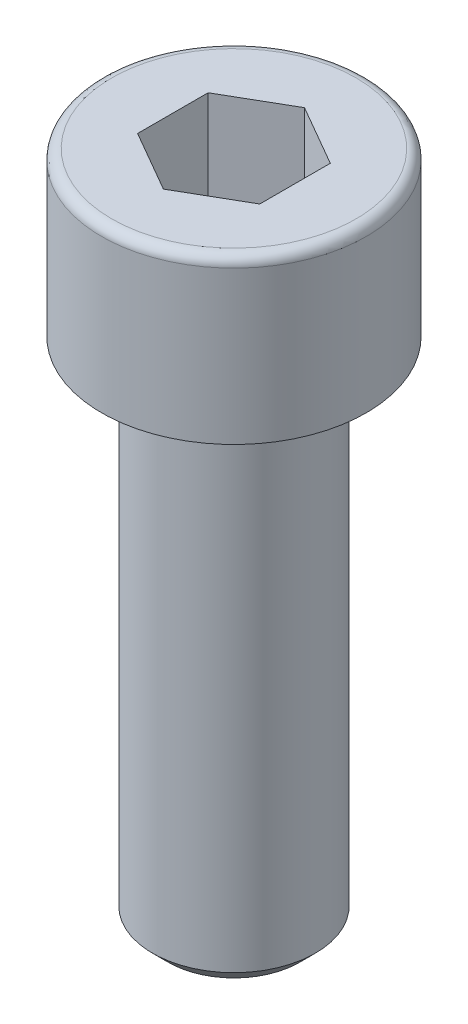
ISO-10303-21;
HEADER;
FILE_DESCRIPTION(('STEP AP214'),'2;1');
FILE_NAME('part.step','',(''),(''),'','','');
FILE_SCHEMA(('AUTOMOTIVE_DESIGN { 1 0 10303 214 1 1 1 1 }'));
ENDSEC;
DATA;
#1=APPLICATION_CONTEXT('core data for automotive mechanical design processes');
#2=APPLICATION_PROTOCOL_DEFINITION('international standard','automotive_design',2000,#1);
#3=PRODUCT_CONTEXT('',#1,'mechanical');
#4=PRODUCT('Part','Part','',(#3));
#5=PRODUCT_RELATED_PRODUCT_CATEGORY('part','',(#4));
#6=PRODUCT_DEFINITION_FORMATION('','',#4);
#7=PRODUCT_DEFINITION_CONTEXT('part definition',#1,'design');
#8=PRODUCT_DEFINITION('design','',#6,#7);
#9=PRODUCT_DEFINITION_SHAPE('','',#8);
#10=(LENGTH_UNIT() NAMED_UNIT(*) SI_UNIT(.MILLI.,.METRE.));
#11=(NAMED_UNIT(*) PLANE_ANGLE_UNIT() SI_UNIT($,.RADIAN.));
#12=(NAMED_UNIT(*) SI_UNIT($,.STERADIAN.) SOLID_ANGLE_UNIT());
#13=UNCERTAINTY_MEASURE_WITH_UNIT(LENGTH_MEASURE(1.E-05),#10,'distance_accuracy_value','');
#14=(GEOMETRIC_REPRESENTATION_CONTEXT(3) GLOBAL_UNCERTAINTY_ASSIGNED_CONTEXT((#13)) GLOBAL_UNIT_ASSIGNED_CONTEXT((#10,
#11,#12)) REPRESENTATION_CONTEXT('',''));
#15=CARTESIAN_POINT('',(0.,0.,0.));
#16=DIRECTION('',(0.,0.,1.));
#17=DIRECTION('',(1.,0.,0.));
#18=AXIS2_PLACEMENT_3D('',#15,#16,#17);
#19=CARTESIAN_POINT('',(0.,8.,0.));
#20=DIRECTION('',(0.,-1.,0.));
#21=DIRECTION('',(0.,0.,-1.));
#22=AXIS2_PLACEMENT_3D('',#19,#20,#21);
#23=PLANE('',#22);
#24=DIRECTION('',(0.866025403784438,0.,0.500000000000001));
#25=VECTOR('',#24,1.);
#26=CARTESIAN_POINT('',(-3.,8.,1.7320508075689));
#27=LINE('',#26,#25);
#28=CARTESIAN_POINT('',(-3.,8.,1.7320508075689));
#29=VERTEX_POINT('',#28);
#30=CARTESIAN_POINT('',(0.,8.,3.4641016151378));
#31=VERTEX_POINT('',#30);
#32=EDGE_CURVE('E71',#29,#31,#27,.T.);
#33=ORIENTED_EDGE('',*,*,#32,.F.);
#34=DIRECTION('',(0.,0.,1.));
#35=VECTOR('',#34,1.);
#36=CARTESIAN_POINT('',(-3.,8.,-1.7320508075689));
#37=LINE('',#36,#35);
#38=CARTESIAN_POINT('',(-3.,8.,-1.7320508075689));
#39=VERTEX_POINT('',#38);
#40=EDGE_CURVE('E83',#39,#29,#37,.T.);
#41=ORIENTED_EDGE('',*,*,#40,.F.);
#42=DIRECTION('',(-0.866025403784438,0.,0.500000000000001));
#43=VECTOR('',#42,1.);
#44=CARTESIAN_POINT('',(0.,8.,-3.4641016151378));
#45=LINE('',#44,#43);
#46=CARTESIAN_POINT('',(0.,8.,-3.4641016151378));
#47=VERTEX_POINT('',#46);
#48=EDGE_CURVE('E94',#47,#39,#45,.T.);
#49=ORIENTED_EDGE('',*,*,#48,.F.);
#50=DIRECTION('',(-0.866025403784438,0.,-0.500000000000001));
#51=VECTOR('',#50,1.);
#52=CARTESIAN_POINT('',(3.,8.,-1.7320508075689));
#53=LINE('',#52,#51);
#54=CARTESIAN_POINT('',(3.,8.,-1.7320508075689));
#55=VERTEX_POINT('',#54);
#56=EDGE_CURVE('E96',#55,#47,#53,.T.);
#57=ORIENTED_EDGE('',*,*,#56,.F.);
#58=DIRECTION('',(0.,0.,-1.));
#59=VECTOR('',#58,1.);
#60=CARTESIAN_POINT('',(3.,8.,1.7320508075689));
#61=LINE('',#60,#59);
#62=CARTESIAN_POINT('',(3.,8.,1.7320508075689));
#63=VERTEX_POINT('',#62);
#64=EDGE_CURVE('E110',#63,#55,#61,.T.);
#65=ORIENTED_EDGE('',*,*,#64,.F.);
#66=DIRECTION('',(0.866025403784438,0.,-0.500000000000001));
#67=VECTOR('',#66,1.);
#68=CARTESIAN_POINT('',(0.,8.,3.4641016151378));
#69=LINE('',#68,#67);
#70=EDGE_CURVE('E86',#31,#63,#69,.T.);
#71=ORIENTED_EDGE('',*,*,#70,.F.);
#72=EDGE_LOOP('',(#33,#41,#49,#57,#65,#71));
#73=FACE_BOUND('',#72,.T.);
#74=CARTESIAN_POINT('',(0.,8.,0.));
#75=DIRECTION('',(0.,-1.,0.));
#76=DIRECTION('',(0.,0.,-1.));
#77=AXIS2_PLACEMENT_3D('',#74,#75,#76);
#78=CIRCLE('',#77,5.99999995919158);
#79=CARTESIAN_POINT('',(0.,8.,-5.99999995919158));
#80=VERTEX_POINT('',#79);
#81=EDGE_CURVE('E113',#80,#80,#78,.T.);
#82=ORIENTED_EDGE('',*,*,#81,.F.);
#83=EDGE_LOOP('',(#82));
#84=FACE_BOUND('',#83,.T.);
#85=ADVANCED_FACE('F16',(#73,#84),#23,.F.);
#86=CARTESIAN_POINT('',(0.,7.50000000000009,0.));
#87=DIRECTION('',(0.,-1.,0.));
#88=DIRECTION('',(0.,0.,-1.));
#89=AXIS2_PLACEMENT_3D('',#86,#87,#88);
#90=TOROIDAL_SURFACE('',#89,6.00000000000009,0.499999999999912);
#91=ORIENTED_EDGE('',*,*,#81,.T.);
#92=EDGE_LOOP('',(#91));
#93=FACE_BOUND('',#92,.T.);
#94=CARTESIAN_POINT('',(0.,7.5,0.));
#95=DIRECTION('',(0.,-1.,0.));
#96=DIRECTION('',(0.,0.,-1.));
#97=AXIS2_PLACEMENT_3D('',#94,#95,#96);
#98=CIRCLE('',#97,6.5);
#99=CARTESIAN_POINT('',(0.,7.5,-6.5));
#100=VERTEX_POINT('',#99);
#101=EDGE_CURVE('E120',#100,#100,#98,.T.);
#102=ORIENTED_EDGE('',*,*,#101,.F.);
#103=EDGE_LOOP('',(#102));
#104=FACE_BOUND('',#103,.T.);
#105=ADVANCED_FACE('F188',(#93,#104),#90,.T.);
#106=CARTESIAN_POINT('',(0.,0.,0.));
#107=DIRECTION('',(0.,-1.,0.));
#108=DIRECTION('',(0.,0.,-1.));
#109=AXIS2_PLACEMENT_3D('',#106,#107,#108);
#110=CYLINDRICAL_SURFACE('',#109,6.5);
#111=CARTESIAN_POINT('',(0.,0.,0.));
#112=DIRECTION('',(0.,-1.,0.));
#113=DIRECTION('',(0.,0.,-1.));
#114=AXIS2_PLACEMENT_3D('',#111,#112,#113);
#115=CIRCLE('',#114,6.5);
#116=CARTESIAN_POINT('',(0.,0.,-6.5));
#117=VERTEX_POINT('',#116);
#118=EDGE_CURVE('E123',#117,#117,#115,.T.);
#119=ORIENTED_EDGE('',*,*,#118,.F.);
#120=EDGE_LOOP('',(#119));
#121=FACE_BOUND('',#120,.T.);
#122=ORIENTED_EDGE('',*,*,#101,.T.);
#123=EDGE_LOOP('',(#122));
#124=FACE_BOUND('',#123,.T.);
#125=ADVANCED_FACE('F183',(#121,#124),#110,.T.);
#126=CARTESIAN_POINT('',(6.5,0.,0.));
#127=DIRECTION('',(0.,1.,0.));
#128=DIRECTION('',(0.,0.,1.));
#129=AXIS2_PLACEMENT_3D('',#126,#127,#128);
#130=PLANE('',#129);
#131=CARTESIAN_POINT('',(0.,0.,0.));
#132=DIRECTION('',(0.,-1.,0.));
#133=DIRECTION('',(0.,0.,-1.));
#134=AXIS2_PLACEMENT_3D('',#131,#132,#133);
#135=CIRCLE('',#134,4.);
#136=CARTESIAN_POINT('',(0.,0.,-4.));
#137=VERTEX_POINT('',#136);
#138=EDGE_CURVE('E77',#137,#137,#135,.T.);
#139=ORIENTED_EDGE('',*,*,#138,.F.);
#140=EDGE_LOOP('',(#139));
#141=FACE_BOUND('',#140,.T.);
#142=ORIENTED_EDGE('',*,*,#118,.T.);
#143=EDGE_LOOP('',(#142));
#144=FACE_BOUND('',#143,.T.);
#145=ADVANCED_FACE('F179',(#141,#144),#130,.F.);
#146=CARTESIAN_POINT('',(-3.,1.14,-1.7320508075689));
#147=DIRECTION('',(-1.,0.,0.));
#148=DIRECTION('',(0.,0.,1.));
#149=AXIS2_PLACEMENT_3D('',#146,#147,#148);
#150=PLANE('',#149);
#151=ORIENTED_EDGE('',*,*,#40,.T.);
#152=DIRECTION('',(0.,1.,0.));
#153=VECTOR('',#152,1.);
#154=CARTESIAN_POINT('',(-3.,1.14,1.7320508075689));
#155=LINE('',#154,#153);
#156=CARTESIAN_POINT('',(-3.,1.14,1.7320508075689));
#157=VERTEX_POINT('',#156);
#158=EDGE_CURVE('E68',#157,#29,#155,.T.);
#159=ORIENTED_EDGE('',*,*,#158,.F.);
#160=DIRECTION('',(0.,0.,1.));
#161=VECTOR('',#160,1.);
#162=CARTESIAN_POINT('',(-3.,1.14,-1.7320508075689));
#163=LINE('',#162,#161);
#164=CARTESIAN_POINT('',(-3.,1.14,-1.7320508075689));
#165=VERTEX_POINT('',#164);
#166=EDGE_CURVE('E80',#165,#157,#163,.T.);
#167=ORIENTED_EDGE('',*,*,#166,.F.);
#168=DIRECTION('',(0.,1.,0.));
#169=VECTOR('',#168,1.);
#170=CARTESIAN_POINT('',(-3.,1.14,-1.7320508075689));
#171=LINE('',#170,#169);
#172=EDGE_CURVE('E91',#165,#39,#171,.T.);
#173=ORIENTED_EDGE('',*,*,#172,.T.);
#174=EDGE_LOOP('',(#151,#159,#167,#173));
#175=FACE_BOUND('',#174,.T.);
#176=ADVANCED_FACE('F93',(#175),#150,.F.);
#177=CARTESIAN_POINT('',(-3.,1.14,1.7320508075689));
#178=DIRECTION('',(-0.500000000000001,0.,0.866025403784438));
#179=DIRECTION('',(0.866025403784438,0.,0.500000000000001));
#180=AXIS2_PLACEMENT_3D('',#177,#178,#179);
#181=PLANE('',#180);
#182=ORIENTED_EDGE('',*,*,#32,.T.);
#183=DIRECTION('',(0.,1.,0.));
#184=VECTOR('',#183,1.);
#185=CARTESIAN_POINT('',(0.,1.14,3.4641016151378));
#186=LINE('',#185,#184);
#187=CARTESIAN_POINT('',(0.,1.14,3.4641016151378));
#188=VERTEX_POINT('',#187);
#189=EDGE_CURVE('E133',#188,#31,#186,.T.);
#190=ORIENTED_EDGE('',*,*,#189,.F.);
#191=DIRECTION('',(0.866025403784438,0.,0.500000000000001));
#192=VECTOR('',#191,1.);
#193=CARTESIAN_POINT('',(-3.,1.14,1.7320508075689));
#194=LINE('',#193,#192);
#195=EDGE_CURVE('E73',#157,#188,#194,.T.);
#196=ORIENTED_EDGE('',*,*,#195,.F.);
#197=ORIENTED_EDGE('',*,*,#158,.T.);
#198=EDGE_LOOP('',(#182,#190,#196,#197));
#199=FACE_BOUND('',#198,.T.);
#200=ADVANCED_FACE('F69',(#199),#181,.F.);
#201=CARTESIAN_POINT('',(0.,1.14,3.4641016151378));
#202=DIRECTION('',(0.500000000000001,0.,0.866025403784438));
#203=DIRECTION('',(0.866025403784438,0.,-0.500000000000001));
#204=AXIS2_PLACEMENT_3D('',#201,#202,#203);
#205=PLANE('',#204);
#206=ORIENTED_EDGE('',*,*,#70,.T.);
#207=DIRECTION('',(0.,1.,0.));
#208=VECTOR('',#207,1.);
#209=CARTESIAN_POINT('',(3.,1.14,1.7320508075689));
#210=LINE('',#209,#208);
#211=CARTESIAN_POINT('',(3.,1.14,1.7320508075689));
#212=VERTEX_POINT('',#211);
#213=EDGE_CURVE('E143',#212,#63,#210,.T.);
#214=ORIENTED_EDGE('',*,*,#213,.F.);
#215=DIRECTION('',(0.866025403784438,0.,-0.500000000000001));
#216=VECTOR('',#215,1.);
#217=CARTESIAN_POINT('',(0.,1.14,3.4641016151378));
#218=LINE('',#217,#216);
#219=EDGE_CURVE('E144',#188,#212,#218,.T.);
#220=ORIENTED_EDGE('',*,*,#219,.F.);
#221=ORIENTED_EDGE('',*,*,#189,.T.);
#222=EDGE_LOOP('',(#206,#214,#220,#221));
#223=FACE_BOUND('',#222,.T.);
#224=ADVANCED_FACE('F206',(#223),#205,.F.);
#225=CARTESIAN_POINT('',(3.,1.14,1.7320508075689));
#226=DIRECTION('',(1.,0.,0.));
#227=DIRECTION('',(0.,0.,-1.));
#228=AXIS2_PLACEMENT_3D('',#225,#226,#227);
#229=PLANE('',#228);
#230=ORIENTED_EDGE('',*,*,#64,.T.);
#231=DIRECTION('',(0.,1.,0.));
#232=VECTOR('',#231,1.);
#233=CARTESIAN_POINT('',(3.,1.14,-1.7320508075689));
#234=LINE('',#233,#232);
#235=CARTESIAN_POINT('',(3.,1.14,-1.7320508075689));
#236=VERTEX_POINT('',#235);
#237=EDGE_CURVE('E149',#236,#55,#234,.T.);
#238=ORIENTED_EDGE('',*,*,#237,.F.);
#239=DIRECTION('',(0.,0.,-1.));
#240=VECTOR('',#239,1.);
#241=CARTESIAN_POINT('',(3.,1.14,1.7320508075689));
#242=LINE('',#241,#240);
#243=EDGE_CURVE('E38',#212,#236,#242,.T.);
#244=ORIENTED_EDGE('',*,*,#243,.F.);
#245=ORIENTED_EDGE('',*,*,#213,.T.);
#246=EDGE_LOOP('',(#230,#238,#244,#245));
#247=FACE_BOUND('',#246,.T.);
#248=ADVANCED_FACE('F207',(#247),#229,.F.);
#249=CARTESIAN_POINT('',(3.,1.14,-1.7320508075689));
#250=DIRECTION('',(0.500000000000001,0.,-0.866025403784438));
#251=DIRECTION('',(-0.866025403784438,0.,-0.500000000000001));
#252=AXIS2_PLACEMENT_3D('',#249,#250,#251);
#253=PLANE('',#252);
#254=ORIENTED_EDGE('',*,*,#56,.T.);
#255=DIRECTION('',(0.,1.,0.));
#256=VECTOR('',#255,1.);
#257=CARTESIAN_POINT('',(0.,1.14,-3.4641016151378));
#258=LINE('',#257,#256);
#259=CARTESIAN_POINT('',(0.,1.14,-3.4641016151378));
#260=VERTEX_POINT('',#259);
#261=EDGE_CURVE('E156',#260,#47,#258,.T.);
#262=ORIENTED_EDGE('',*,*,#261,.F.);
#263=DIRECTION('',(-0.866025403784438,0.,-0.500000000000001));
#264=VECTOR('',#263,1.);
#265=CARTESIAN_POINT('',(3.,1.14,-1.7320508075689));
#266=LINE('',#265,#264);
#267=EDGE_CURVE('E33',#236,#260,#266,.T.);
#268=ORIENTED_EDGE('',*,*,#267,.F.);
#269=ORIENTED_EDGE('',*,*,#237,.T.);
#270=EDGE_LOOP('',(#254,#262,#268,#269));
#271=FACE_BOUND('',#270,.T.);
#272=ADVANCED_FACE('F213',(#271),#253,.F.);
#273=CARTESIAN_POINT('',(0.,1.14,-3.4641016151378));
#274=DIRECTION('',(-0.500000000000001,0.,-0.866025403784438));
#275=DIRECTION('',(-0.866025403784438,0.,0.500000000000001));
#276=AXIS2_PLACEMENT_3D('',#273,#274,#275);
#277=PLANE('',#276);
#278=ORIENTED_EDGE('',*,*,#48,.T.);
#279=ORIENTED_EDGE('',*,*,#172,.F.);
#280=DIRECTION('',(-0.866025403784438,0.,0.500000000000001));
#281=VECTOR('',#280,1.);
#282=CARTESIAN_POINT('',(0.,1.14,-3.4641016151378));
#283=LINE('',#282,#281);
#284=EDGE_CURVE('E162',#260,#165,#283,.T.);
#285=ORIENTED_EDGE('',*,*,#284,.F.);
#286=ORIENTED_EDGE('',*,*,#261,.T.);
#287=EDGE_LOOP('',(#278,#279,#285,#286));
#288=FACE_BOUND('',#287,.T.);
#289=ADVANCED_FACE('F220',(#288),#277,.F.);
#290=CARTESIAN_POINT('',(0.,1.14,0.));
#291=DIRECTION('',(0.,1.,0.));
#292=DIRECTION('',(0.,0.,1.));
#293=AXIS2_PLACEMENT_3D('',#290,#291,#292);
#294=PLANE('',#293);
#295=ORIENTED_EDGE('',*,*,#166,.T.);
#296=ORIENTED_EDGE('',*,*,#195,.T.);
#297=ORIENTED_EDGE('',*,*,#219,.T.);
#298=ORIENTED_EDGE('',*,*,#243,.T.);
#299=ORIENTED_EDGE('',*,*,#267,.T.);
#300=ORIENTED_EDGE('',*,*,#284,.T.);
#301=EDGE_LOOP('',(#295,#296,#297,#298,#299,#300));
#302=FACE_BOUND('',#301,.T.);
#303=ADVANCED_FACE('F176',(#302),#294,.T.);
#304=CARTESIAN_POINT('',(0.,-25.,0.));
#305=DIRECTION('',(0.,-1.,0.));
#306=DIRECTION('',(0.,0.,-1.));
#307=AXIS2_PLACEMENT_3D('',#304,#305,#306);
#308=CYLINDRICAL_SURFACE('',#307,4.);
#309=CARTESIAN_POINT('',(0.,-24.233,0.));
#310=DIRECTION('',(0.,-1.,0.));
#311=DIRECTION('',(0.,0.,-1.));
#312=AXIS2_PLACEMENT_3D('',#309,#310,#311);
#313=CIRCLE('',#312,4.);
#314=CARTESIAN_POINT('',(0.,-24.233,-4.));
#315=VERTEX_POINT('',#314);
#316=EDGE_CURVE('E24',#315,#315,#313,.T.);
#317=ORIENTED_EDGE('',*,*,#316,.F.);
#318=EDGE_LOOP('',(#317));
#319=FACE_BOUND('',#318,.T.);
#320=ORIENTED_EDGE('',*,*,#138,.T.);
#321=EDGE_LOOP('',(#320));
#322=FACE_BOUND('',#321,.T.);
#323=ADVANCED_FACE('F174',(#319,#322),#308,.T.);
#324=CARTESIAN_POINT('',(0.,-24.233,0.));
#325=DIRECTION('',(0.,1.,0.));
#326=DIRECTION('',(0.,0.,1.));
#327=AXIS2_PLACEMENT_3D('',#324,#325,#326);
#328=CONICAL_SURFACE('',#327,4.,0.785398163397448);
#329=CARTESIAN_POINT('',(0.,-25.,0.));
#330=DIRECTION('',(0.,-1.,0.));
#331=DIRECTION('',(0.,0.,-1.));
#332=AXIS2_PLACEMENT_3D('',#329,#330,#331);
#333=CIRCLE('',#332,3.233);
#334=CARTESIAN_POINT('',(0.,-25.,-3.233));
#335=VERTEX_POINT('',#334);
#336=EDGE_CURVE('E11',#335,#335,#333,.T.);
#337=ORIENTED_EDGE('',*,*,#336,.F.);
#338=EDGE_LOOP('',(#337));
#339=FACE_BOUND('',#338,.T.);
#340=ORIENTED_EDGE('',*,*,#316,.T.);
#341=EDGE_LOOP('',(#340));
#342=FACE_BOUND('',#341,.T.);
#343=ADVANCED_FACE('F171',(#339,#342),#328,.T.);
#344=CARTESIAN_POINT('',(3.233,-25.,0.));
#345=DIRECTION('',(0.,1.,0.));
#346=DIRECTION('',(0.,0.,1.));
#347=AXIS2_PLACEMENT_3D('',#344,#345,#346);
#348=PLANE('',#347);
#349=ORIENTED_EDGE('',*,*,#336,.T.);
#350=EDGE_LOOP('',(#349));
#351=FACE_BOUND('',#350,.T.);
#352=ADVANCED_FACE('F18',(#351),#348,.F.);
#353=CLOSED_SHELL('',(#85,#105,#125,#145,#176,#200,#224,#248,#272,#289,#303,#323,#343,#352));
#354=MANIFOLD_SOLID_BREP('B1',#353);
#355=ADVANCED_BREP_SHAPE_REPRESENTATION('',(#18,#354),#14);
#356=SHAPE_DEFINITION_REPRESENTATION(#9,#355);
ENDSEC;
END-ISO-10303-21;
